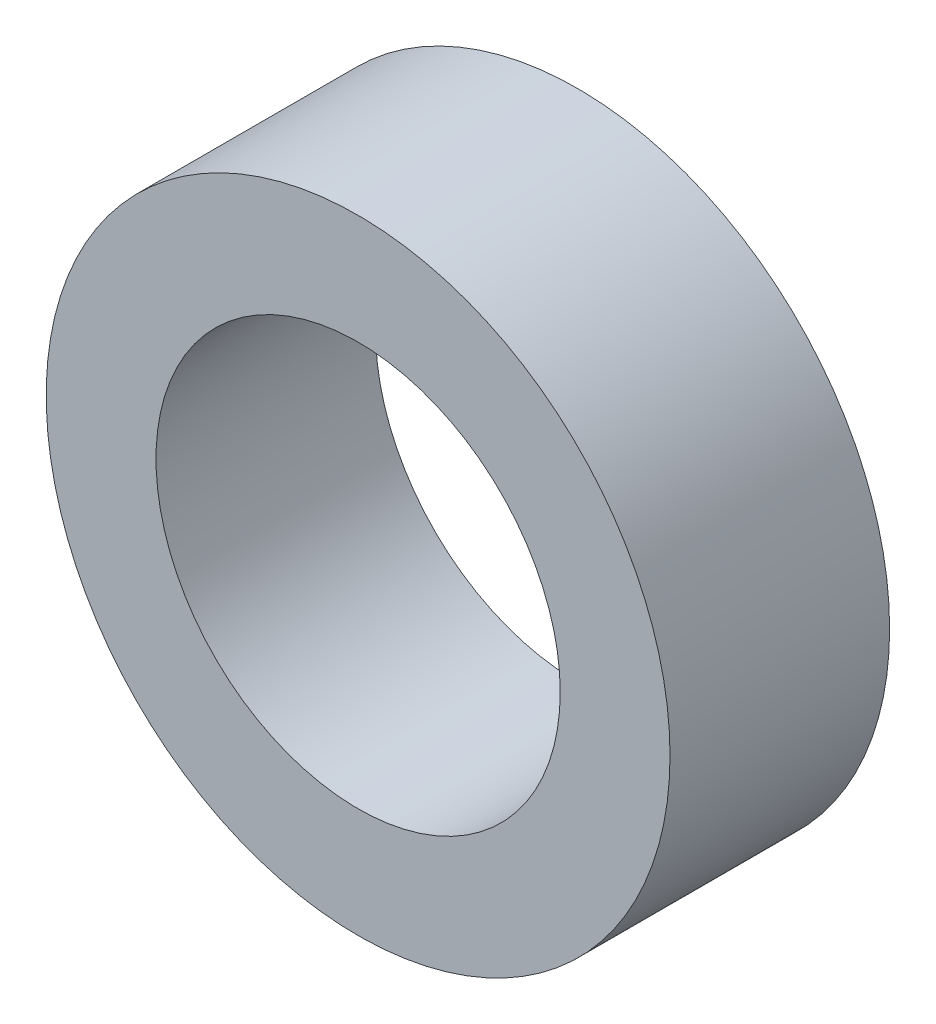
ISO-10303-21;
HEADER;
FILE_DESCRIPTION(('STEP AP214'),'2;1');
FILE_NAME('part.step','',(''),(''),'','','');
FILE_SCHEMA(('AUTOMOTIVE_DESIGN { 1 0 10303 214 1 1 1 1 }'));
ENDSEC;
DATA;
#1=APPLICATION_CONTEXT('core data for automotive mechanical design processes');
#2=APPLICATION_PROTOCOL_DEFINITION('international standard','automotive_design',2000,#1);
#3=PRODUCT_CONTEXT('',#1,'mechanical');
#4=PRODUCT('Part','Part','',(#3));
#5=PRODUCT_RELATED_PRODUCT_CATEGORY('part','',(#4));
#6=PRODUCT_DEFINITION_FORMATION('','',#4);
#7=PRODUCT_DEFINITION_CONTEXT('part definition',#1,'design');
#8=PRODUCT_DEFINITION('design','',#6,#7);
#9=PRODUCT_DEFINITION_SHAPE('','',#8);
#10=(LENGTH_UNIT() NAMED_UNIT(*) SI_UNIT(.MILLI.,.METRE.));
#11=(NAMED_UNIT(*) PLANE_ANGLE_UNIT() SI_UNIT($,.RADIAN.));
#12=(NAMED_UNIT(*) SI_UNIT($,.STERADIAN.) SOLID_ANGLE_UNIT());
#13=UNCERTAINTY_MEASURE_WITH_UNIT(LENGTH_MEASURE(1.E-05),#10,'distance_accuracy_value','');
#14=(GEOMETRIC_REPRESENTATION_CONTEXT(3) GLOBAL_UNCERTAINTY_ASSIGNED_CONTEXT((#13)) GLOBAL_UNIT_ASSIGNED_CONTEXT((#10,
#11,#12)) REPRESENTATION_CONTEXT('',''));
#15=CARTESIAN_POINT('',(0.,0.,0.));
#16=DIRECTION('',(0.,0.,1.));
#17=DIRECTION('',(1.,0.,0.));
#18=AXIS2_PLACEMENT_3D('',#15,#16,#17);
#19=CARTESIAN_POINT('',(0.,0.,5.588));
#20=DIRECTION('',(0.,0.,1.));
#21=DIRECTION('',(1.,0.,0.));
#22=AXIS2_PLACEMENT_3D('',#19,#20,#21);
#23=PLANE('',#22);
#24=CARTESIAN_POINT('',(0.,0.,5.588));
#25=DIRECTION('',(0.,0.,1.));
#26=DIRECTION('',(1.,0.,0.));
#27=AXIS2_PLACEMENT_3D('',#24,#25,#26);
#28=CIRCLE('',#27,7.9375);
#29=CARTESIAN_POINT('',(7.9375,0.,5.588));
#30=VERTEX_POINT('',#29);
#31=EDGE_CURVE('E10',#30,#30,#28,.T.);
#32=ORIENTED_EDGE('',*,*,#31,.T.);
#33=EDGE_LOOP('',(#32));
#34=FACE_BOUND('',#33,.T.);
#35=CARTESIAN_POINT('',(0.,0.,5.588));
#36=DIRECTION('',(0.,0.,1.));
#37=DIRECTION('',(1.,0.,0.));
#38=AXIS2_PLACEMENT_3D('',#35,#36,#37);
#39=CIRCLE('',#38,5.1435);
#40=CARTESIAN_POINT('',(5.1435,0.,5.588));
#41=VERTEX_POINT('',#40);
#42=EDGE_CURVE('E42',#41,#41,#39,.T.);
#43=ORIENTED_EDGE('',*,*,#42,.F.);
#44=EDGE_LOOP('',(#43));
#45=FACE_BOUND('',#44,.T.);
#46=ADVANCED_FACE('F31',(#34,#45),#23,.T.);
#47=CARTESIAN_POINT('',(0.,0.,0.));
#48=DIRECTION('',(0.,0.,1.));
#49=DIRECTION('',(1.,0.,0.));
#50=AXIS2_PLACEMENT_3D('',#47,#48,#49);
#51=PLANE('',#50);
#52=CARTESIAN_POINT('',(0.,0.,0.));
#53=DIRECTION('',(0.,0.,1.));
#54=DIRECTION('',(1.,0.,0.));
#55=AXIS2_PLACEMENT_3D('',#52,#53,#54);
#56=CIRCLE('',#55,7.9375);
#57=CARTESIAN_POINT('',(7.9375,0.,0.));
#58=VERTEX_POINT('',#57);
#59=EDGE_CURVE('E35',#58,#58,#56,.T.);
#60=ORIENTED_EDGE('',*,*,#59,.F.);
#61=EDGE_LOOP('',(#60));
#62=FACE_BOUND('',#61,.T.);
#63=CARTESIAN_POINT('',(0.,0.,0.));
#64=DIRECTION('',(0.,0.,1.));
#65=DIRECTION('',(1.,0.,0.));
#66=AXIS2_PLACEMENT_3D('',#63,#64,#65);
#67=CIRCLE('',#66,5.1435);
#68=CARTESIAN_POINT('',(5.1435,0.,0.));
#69=VERTEX_POINT('',#68);
#70=EDGE_CURVE('E44',#69,#69,#67,.T.);
#71=ORIENTED_EDGE('',*,*,#70,.T.);
#72=EDGE_LOOP('',(#71));
#73=FACE_BOUND('',#72,.T.);
#74=ADVANCED_FACE('F54',(#62,#73),#51,.F.);
#75=CARTESIAN_POINT('',(0.,0.,5.588));
#76=DIRECTION('',(0.,0.,-1.));
#77=DIRECTION('',(-1.,0.,0.));
#78=AXIS2_PLACEMENT_3D('',#75,#76,#77);
#79=CYLINDRICAL_SURFACE('',#78,7.9375);
#80=ORIENTED_EDGE('',*,*,#31,.F.);
#81=EDGE_LOOP('',(#80));
#82=FACE_BOUND('',#81,.T.);
#83=ORIENTED_EDGE('',*,*,#59,.T.);
#84=EDGE_LOOP('',(#83));
#85=FACE_BOUND('',#84,.T.);
#86=ADVANCED_FACE('F33',(#82,#85),#79,.T.);
#87=CARTESIAN_POINT('',(0.,0.,5.588));
#88=DIRECTION('',(0.,0.,-1.));
#89=DIRECTION('',(-1.,0.,0.));
#90=AXIS2_PLACEMENT_3D('',#87,#88,#89);
#91=CYLINDRICAL_SURFACE('',#90,5.1435);
#92=ORIENTED_EDGE('',*,*,#42,.T.);
#93=EDGE_LOOP('',(#92));
#94=FACE_BOUND('',#93,.T.);
#95=ORIENTED_EDGE('',*,*,#70,.F.);
#96=EDGE_LOOP('',(#95));
#97=FACE_BOUND('',#96,.T.);
#98=ADVANCED_FACE('F50',(#94,#97),#91,.F.);
#99=CLOSED_SHELL('',(#46,#74,#86,#98));
#100=MANIFOLD_SOLID_BREP('B2',#99);
#101=ADVANCED_BREP_SHAPE_REPRESENTATION('',(#18,#100),#14);
#102=SHAPE_DEFINITION_REPRESENTATION(#9,#101);
ENDSEC;
END-ISO-10303-21;
